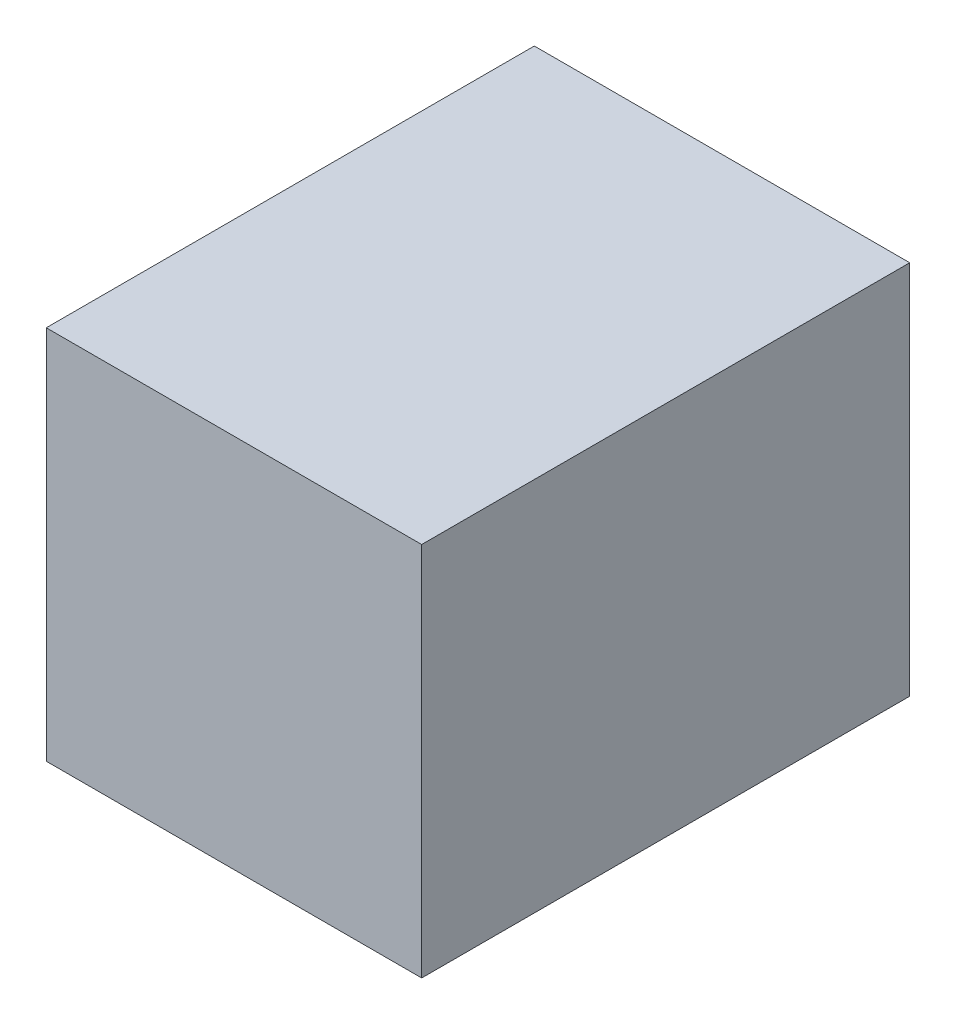
ISO-10303-21;
HEADER;
FILE_DESCRIPTION(('STEP AP214'),'2;1');
FILE_NAME('part.step','',(''),(''),'','','');
FILE_SCHEMA(('AUTOMOTIVE_DESIGN { 1 0 10303 214 1 1 1 1 }'));
ENDSEC;
DATA;
#1=APPLICATION_CONTEXT('core data for automotive mechanical design processes');
#2=APPLICATION_PROTOCOL_DEFINITION('international standard','automotive_design',2000,#1);
#3=PRODUCT_CONTEXT('',#1,'mechanical');
#4=PRODUCT('Part','Part','',(#3));
#5=PRODUCT_RELATED_PRODUCT_CATEGORY('part','',(#4));
#6=PRODUCT_DEFINITION_FORMATION('','',#4);
#7=PRODUCT_DEFINITION_CONTEXT('part definition',#1,'design');
#8=PRODUCT_DEFINITION('design','',#6,#7);
#9=PRODUCT_DEFINITION_SHAPE('','',#8);
#10=(LENGTH_UNIT() NAMED_UNIT(*) SI_UNIT(.MILLI.,.METRE.));
#11=(NAMED_UNIT(*) PLANE_ANGLE_UNIT() SI_UNIT($,.RADIAN.));
#12=(NAMED_UNIT(*) SI_UNIT($,.STERADIAN.) SOLID_ANGLE_UNIT());
#13=UNCERTAINTY_MEASURE_WITH_UNIT(LENGTH_MEASURE(1.E-05),#10,'distance_accuracy_value','');
#14=(GEOMETRIC_REPRESENTATION_CONTEXT(3) GLOBAL_UNCERTAINTY_ASSIGNED_CONTEXT((#13)) GLOBAL_UNIT_ASSIGNED_CONTEXT((#10,
#11,#12)) REPRESENTATION_CONTEXT('',''));
#15=CARTESIAN_POINT('',(0.,0.,0.));
#16=DIRECTION('',(0.,0.,1.));
#17=DIRECTION('',(1.,0.,0.));
#18=AXIS2_PLACEMENT_3D('',#15,#16,#17);
#19=CARTESIAN_POINT('',(0.,0.,-3.));
#20=DIRECTION('',(-1.,0.,0.));
#21=DIRECTION('',(0.,0.,1.));
#22=AXIS2_PLACEMENT_3D('',#19,#20,#21);
#23=PLANE('',#22);
#24=DIRECTION('',(0.,0.,1.));
#25=VECTOR('',#24,1.);
#26=CARTESIAN_POINT('',(0.,0.,-3.));
#27=LINE('',#26,#25);
#28=CARTESIAN_POINT('',(0.,0.,-3.));
#29=VERTEX_POINT('',#28);
#30=CARTESIAN_POINT('',(0.,0.,10.));
#31=VERTEX_POINT('',#30);
#32=EDGE_CURVE('E42',#29,#31,#27,.T.);
#33=ORIENTED_EDGE('',*,*,#32,.T.);
#34=DIRECTION('',(0.,-1.,0.));
#35=VECTOR('',#34,1.);
#36=CARTESIAN_POINT('',(0.,0.,10.));
#37=LINE('',#36,#35);
#38=CARTESIAN_POINT('',(0.,10.,10.));
#39=VERTEX_POINT('',#38);
#40=EDGE_CURVE('E82',#39,#31,#37,.T.);
#41=ORIENTED_EDGE('',*,*,#40,.F.);
#42=DIRECTION('',(0.,0.,1.));
#43=VECTOR('',#42,1.);
#44=CARTESIAN_POINT('',(0.,10.,-3.));
#45=LINE('',#44,#43);
#46=CARTESIAN_POINT('',(0.,10.,-3.));
#47=VERTEX_POINT('',#46);
#48=EDGE_CURVE('E11',#47,#39,#45,.T.);
#49=ORIENTED_EDGE('',*,*,#48,.F.);
#50=DIRECTION('',(0.,-1.,0.));
#51=VECTOR('',#50,1.);
#52=CARTESIAN_POINT('',(0.,0.,-3.));
#53=LINE('',#52,#51);
#54=EDGE_CURVE('E85',#47,#29,#53,.T.);
#55=ORIENTED_EDGE('',*,*,#54,.T.);
#56=EDGE_LOOP('',(#33,#41,#49,#55));
#57=FACE_BOUND('',#56,.T.);
#58=ADVANCED_FACE('F41',(#57),#23,.T.);
#59=CARTESIAN_POINT('',(0.,10.,-3.));
#60=DIRECTION('',(0.,1.,0.));
#61=DIRECTION('',(0.,0.,1.));
#62=AXIS2_PLACEMENT_3D('',#59,#60,#61);
#63=PLANE('',#62);
#64=ORIENTED_EDGE('',*,*,#48,.T.);
#65=DIRECTION('',(-1.,0.,0.));
#66=VECTOR('',#65,1.);
#67=CARTESIAN_POINT('',(0.,10.,10.));
#68=LINE('',#67,#66);
#69=CARTESIAN_POINT('',(10.,10.,10.));
#70=VERTEX_POINT('',#69);
#71=EDGE_CURVE('E98',#70,#39,#68,.T.);
#72=ORIENTED_EDGE('',*,*,#71,.F.);
#73=DIRECTION('',(0.,0.,1.));
#74=VECTOR('',#73,1.);
#75=CARTESIAN_POINT('',(10.,10.,-3.));
#76=LINE('',#75,#74);
#77=CARTESIAN_POINT('',(10.,10.,-3.));
#78=VERTEX_POINT('',#77);
#79=EDGE_CURVE('E47',#78,#70,#76,.T.);
#80=ORIENTED_EDGE('',*,*,#79,.F.);
#81=DIRECTION('',(-1.,0.,0.));
#82=VECTOR('',#81,1.);
#83=CARTESIAN_POINT('',(0.,10.,-3.));
#84=LINE('',#83,#82);
#85=EDGE_CURVE('E87',#78,#47,#84,.T.);
#86=ORIENTED_EDGE('',*,*,#85,.T.);
#87=EDGE_LOOP('',(#64,#72,#80,#86));
#88=FACE_BOUND('',#87,.T.);
#89=ADVANCED_FACE('F114',(#88),#63,.T.);
#90=CARTESIAN_POINT('',(10.,0.,-3.));
#91=DIRECTION('',(1.,0.,0.));
#92=DIRECTION('',(0.,0.,-1.));
#93=AXIS2_PLACEMENT_3D('',#90,#91,#92);
#94=PLANE('',#93);
#95=ORIENTED_EDGE('',*,*,#79,.T.);
#96=DIRECTION('',(0.,1.,0.));
#97=VECTOR('',#96,1.);
#98=CARTESIAN_POINT('',(10.,0.,10.));
#99=LINE('',#98,#97);
#100=CARTESIAN_POINT('',(10.,0.,10.));
#101=VERTEX_POINT('',#100);
#102=EDGE_CURVE('E94',#101,#70,#99,.T.);
#103=ORIENTED_EDGE('',*,*,#102,.F.);
#104=DIRECTION('',(0.,0.,1.));
#105=VECTOR('',#104,1.);
#106=CARTESIAN_POINT('',(10.,0.,-3.));
#107=LINE('',#106,#105);
#108=CARTESIAN_POINT('',(10.,0.,-3.));
#109=VERTEX_POINT('',#108);
#110=EDGE_CURVE('E88',#109,#101,#107,.T.);
#111=ORIENTED_EDGE('',*,*,#110,.F.);
#112=DIRECTION('',(0.,1.,0.));
#113=VECTOR('',#112,1.);
#114=CARTESIAN_POINT('',(10.,0.,-3.));
#115=LINE('',#114,#113);
#116=EDGE_CURVE('E106',#109,#78,#115,.T.);
#117=ORIENTED_EDGE('',*,*,#116,.T.);
#118=EDGE_LOOP('',(#95,#103,#111,#117));
#119=FACE_BOUND('',#118,.T.);
#120=ADVANCED_FACE('F109',(#119),#94,.T.);
#121=CARTESIAN_POINT('',(0.,0.,-3.));
#122=DIRECTION('',(0.,-1.,0.));
#123=DIRECTION('',(0.,0.,-1.));
#124=AXIS2_PLACEMENT_3D('',#121,#122,#123);
#125=PLANE('',#124);
#126=ORIENTED_EDGE('',*,*,#110,.T.);
#127=DIRECTION('',(1.,0.,0.));
#128=VECTOR('',#127,1.);
#129=CARTESIAN_POINT('',(0.,0.,10.));
#130=LINE('',#129,#128);
#131=EDGE_CURVE('E90',#31,#101,#130,.T.);
#132=ORIENTED_EDGE('',*,*,#131,.F.);
#133=ORIENTED_EDGE('',*,*,#32,.F.);
#134=DIRECTION('',(1.,0.,0.));
#135=VECTOR('',#134,1.);
#136=CARTESIAN_POINT('',(0.,0.,-3.));
#137=LINE('',#136,#135);
#138=EDGE_CURVE('E102',#29,#109,#137,.T.);
#139=ORIENTED_EDGE('',*,*,#138,.T.);
#140=EDGE_LOOP('',(#126,#132,#133,#139));
#141=FACE_BOUND('',#140,.T.);
#142=ADVANCED_FACE('F89',(#141),#125,.T.);
#143=CARTESIAN_POINT('',(0.,0.,-3.));
#144=DIRECTION('',(0.,0.,-1.));
#145=DIRECTION('',(-1.,0.,0.));
#146=AXIS2_PLACEMENT_3D('',#143,#144,#145);
#147=PLANE('',#146);
#148=ORIENTED_EDGE('',*,*,#54,.F.);
#149=ORIENTED_EDGE('',*,*,#85,.F.);
#150=ORIENTED_EDGE('',*,*,#116,.F.);
#151=ORIENTED_EDGE('',*,*,#138,.F.);
#152=EDGE_LOOP('',(#148,#149,#150,#151));
#153=FACE_BOUND('',#152,.T.);
#154=ADVANCED_FACE('F113',(#153),#147,.T.);
#155=CARTESIAN_POINT('',(0.,0.,10.));
#156=DIRECTION('',(0.,0.,-1.));
#157=DIRECTION('',(-1.,0.,0.));
#158=AXIS2_PLACEMENT_3D('',#155,#156,#157);
#159=PLANE('',#158);
#160=ORIENTED_EDGE('',*,*,#40,.T.);
#161=ORIENTED_EDGE('',*,*,#131,.T.);
#162=ORIENTED_EDGE('',*,*,#102,.T.);
#163=ORIENTED_EDGE('',*,*,#71,.T.);
#164=EDGE_LOOP('',(#160,#161,#162,#163));
#165=FACE_BOUND('',#164,.T.);
#166=ADVANCED_FACE('F100',(#165),#159,.F.);
#167=CLOSED_SHELL('',(#58,#89,#120,#142,#154,#166));
#168=MANIFOLD_SOLID_BREP('B2',#167);
#169=ADVANCED_BREP_SHAPE_REPRESENTATION('',(#18,#168),#14);
#170=SHAPE_DEFINITION_REPRESENTATION(#9,#169);
ENDSEC;
END-ISO-10303-21;
